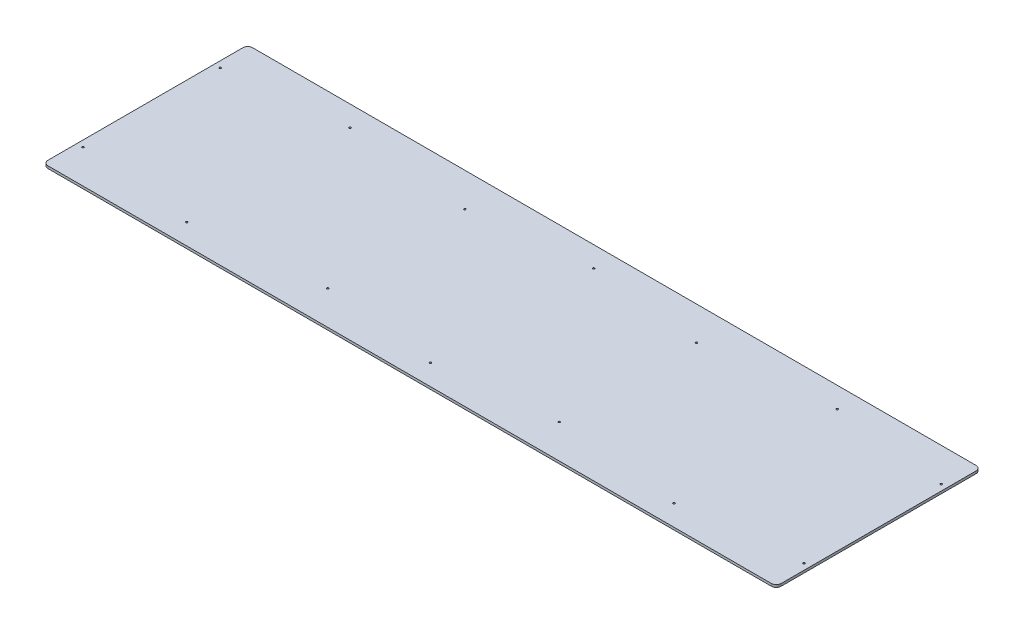
ISO-10303-21;
HEADER;
FILE_DESCRIPTION(('STEP AP214'),'2;1');
FILE_NAME('part.step','',(''),(''),'','','');
FILE_SCHEMA(('AUTOMOTIVE_DESIGN { 1 0 10303 214 1 1 1 1 }'));
ENDSEC;
DATA;
#1=APPLICATION_CONTEXT('core data for automotive mechanical design processes');
#2=APPLICATION_PROTOCOL_DEFINITION('international standard','automotive_design',2000,#1);
#3=PRODUCT_CONTEXT('',#1,'mechanical');
#4=PRODUCT('Part','Part','',(#3));
#5=PRODUCT_RELATED_PRODUCT_CATEGORY('part','',(#4));
#6=PRODUCT_DEFINITION_FORMATION('','',#4);
#7=PRODUCT_DEFINITION_CONTEXT('part definition',#1,'design');
#8=PRODUCT_DEFINITION('design','',#6,#7);
#9=PRODUCT_DEFINITION_SHAPE('','',#8);
#10=(LENGTH_UNIT() NAMED_UNIT(*) SI_UNIT(.MILLI.,.METRE.));
#11=(NAMED_UNIT(*) PLANE_ANGLE_UNIT() SI_UNIT($,.RADIAN.));
#12=(NAMED_UNIT(*) SI_UNIT($,.STERADIAN.) SOLID_ANGLE_UNIT());
#13=UNCERTAINTY_MEASURE_WITH_UNIT(LENGTH_MEASURE(1.E-05),#10,'distance_accuracy_value','');
#14=(GEOMETRIC_REPRESENTATION_CONTEXT(3) GLOBAL_UNCERTAINTY_ASSIGNED_CONTEXT((#13)) GLOBAL_UNIT_ASSIGNED_CONTEXT((#10,
#11,#12)) REPRESENTATION_CONTEXT('',''));
#15=CARTESIAN_POINT('',(0.,0.,0.));
#16=DIRECTION('',(0.,0.,1.));
#17=DIRECTION('',(1.,0.,0.));
#18=AXIS2_PLACEMENT_3D('',#15,#16,#17);
#19=CARTESIAN_POINT('',(0.,6.35,0.));
#20=DIRECTION('',(1.,0.,0.));
#21=DIRECTION('',(0.,0.,-1.));
#22=AXIS2_PLACEMENT_3D('',#19,#20,#21);
#23=PLANE('',#22);
#24=DIRECTION('',(0.,0.,1.));
#25=VECTOR('',#24,1.);
#26=CARTESIAN_POINT('',(0.,6.35,0.));
#27=LINE('',#26,#25);
#28=CARTESIAN_POINT('',(0.,6.35,-520.7));
#29=VERTEX_POINT('',#28);
#30=CARTESIAN_POINT('',(0.,6.35,-12.7));
#31=VERTEX_POINT('',#30);
#32=EDGE_CURVE('E125',#29,#31,#27,.T.);
#33=ORIENTED_EDGE('',*,*,#32,.F.);
#34=DIRECTION('',(0.,-1.,0.));
#35=VECTOR('',#34,1.);
#36=CARTESIAN_POINT('',(0.,6.35,-520.7));
#37=LINE('',#36,#35);
#38=CARTESIAN_POINT('',(0.,0.,-520.7));
#39=VERTEX_POINT('',#38);
#40=EDGE_CURVE('E151',#29,#39,#37,.T.);
#41=ORIENTED_EDGE('',*,*,#40,.T.);
#42=DIRECTION('',(0.,0.,1.));
#43=VECTOR('',#42,1.);
#44=CARTESIAN_POINT('',(0.,0.,0.));
#45=LINE('',#44,#43);
#46=CARTESIAN_POINT('',(0.,0.,-12.7));
#47=VERTEX_POINT('',#46);
#48=EDGE_CURVE('E159',#39,#47,#45,.T.);
#49=ORIENTED_EDGE('',*,*,#48,.T.);
#50=DIRECTION('',(0.,-1.,0.));
#51=VECTOR('',#50,1.);
#52=CARTESIAN_POINT('',(0.,6.35,-12.7));
#53=LINE('',#52,#51);
#54=EDGE_CURVE('E149',#47,#31,#53,.F.);
#55=ORIENTED_EDGE('',*,*,#54,.T.);
#56=EDGE_LOOP('',(#33,#41,#49,#55));
#57=FACE_BOUND('',#56,.T.);
#58=ADVANCED_FACE('F34',(#57),#23,.F.);
#59=CARTESIAN_POINT('',(0.,6.35,0.));
#60=DIRECTION('',(0.,0.,-1.));
#61=DIRECTION('',(-1.,0.,0.));
#62=AXIS2_PLACEMENT_3D('',#59,#60,#61);
#63=PLANE('',#62);
#64=DIRECTION('',(1.,0.,0.));
#65=VECTOR('',#64,1.);
#66=CARTESIAN_POINT('',(0.,0.,0.));
#67=LINE('',#66,#65);
#68=CARTESIAN_POINT('',(12.7,0.,0.));
#69=VERTEX_POINT('',#68);
#70=CARTESIAN_POINT('',(1898.65,0.,0.));
#71=VERTEX_POINT('',#70);
#72=EDGE_CURVE('E130',#69,#71,#67,.T.);
#73=ORIENTED_EDGE('',*,*,#72,.T.);
#74=DIRECTION('',(0.,-1.,0.));
#75=VECTOR('',#74,1.);
#76=CARTESIAN_POINT('',(1898.65,6.35,0.));
#77=LINE('',#76,#75);
#78=CARTESIAN_POINT('',(1898.65,6.35,0.));
#79=VERTEX_POINT('',#78);
#80=EDGE_CURVE('E11',#71,#79,#77,.F.);
#81=ORIENTED_EDGE('',*,*,#80,.T.);
#82=DIRECTION('',(1.,0.,0.));
#83=VECTOR('',#82,1.);
#84=CARTESIAN_POINT('',(0.,6.35,0.));
#85=LINE('',#84,#83);
#86=CARTESIAN_POINT('',(12.7,6.35,0.));
#87=VERTEX_POINT('',#86);
#88=EDGE_CURVE('E128',#87,#79,#85,.T.);
#89=ORIENTED_EDGE('',*,*,#88,.F.);
#90=DIRECTION('',(0.,-1.,0.));
#91=VECTOR('',#90,1.);
#92=CARTESIAN_POINT('',(12.7,6.35,0.));
#93=LINE('',#92,#91);
#94=EDGE_CURVE('E42',#87,#69,#93,.T.);
#95=ORIENTED_EDGE('',*,*,#94,.T.);
#96=EDGE_LOOP('',(#73,#81,#89,#95));
#97=FACE_BOUND('',#96,.T.);
#98=ADVANCED_FACE('F156',(#97),#63,.F.);
#99=CARTESIAN_POINT('',(1911.35,6.35,0.));
#100=DIRECTION('',(-1.,0.,0.));
#101=DIRECTION('',(0.,0.,1.));
#102=AXIS2_PLACEMENT_3D('',#99,#100,#101);
#103=PLANE('',#102);
#104=DIRECTION('',(0.,0.,-1.));
#105=VECTOR('',#104,1.);
#106=CARTESIAN_POINT('',(1911.35,0.,0.));
#107=LINE('',#106,#105);
#108=CARTESIAN_POINT('',(1911.35,0.,-12.7));
#109=VERTEX_POINT('',#108);
#110=CARTESIAN_POINT('',(1911.35,0.,-520.7));
#111=VERTEX_POINT('',#110);
#112=EDGE_CURVE('E126',#109,#111,#107,.T.);
#113=ORIENTED_EDGE('',*,*,#112,.T.);
#114=DIRECTION('',(0.,-1.,0.));
#115=VECTOR('',#114,1.);
#116=CARTESIAN_POINT('',(1911.35,6.35,-520.7));
#117=LINE('',#116,#115);
#118=CARTESIAN_POINT('',(1911.35,6.35,-520.7));
#119=VERTEX_POINT('',#118);
#120=EDGE_CURVE('E104',#111,#119,#117,.F.);
#121=ORIENTED_EDGE('',*,*,#120,.T.);
#122=DIRECTION('',(0.,0.,-1.));
#123=VECTOR('',#122,1.);
#124=CARTESIAN_POINT('',(1911.35,6.35,0.));
#125=LINE('',#124,#123);
#126=CARTESIAN_POINT('',(1911.35,6.35,-12.7));
#127=VERTEX_POINT('',#126);
#128=EDGE_CURVE('E164',#127,#119,#125,.T.);
#129=ORIENTED_EDGE('',*,*,#128,.F.);
#130=DIRECTION('',(0.,-1.,0.));
#131=VECTOR('',#130,1.);
#132=CARTESIAN_POINT('',(1911.35,6.35,-12.7));
#133=LINE('',#132,#131);
#134=EDGE_CURVE('E109',#127,#109,#133,.T.);
#135=ORIENTED_EDGE('',*,*,#134,.T.);
#136=EDGE_LOOP('',(#113,#121,#129,#135));
#137=FACE_BOUND('',#136,.T.);
#138=ADVANCED_FACE('F288',(#137),#103,.F.);
#139=CARTESIAN_POINT('',(0.,6.35,-533.4));
#140=DIRECTION('',(0.,0.,1.));
#141=DIRECTION('',(1.,0.,0.));
#142=AXIS2_PLACEMENT_3D('',#139,#140,#141);
#143=PLANE('',#142);
#144=DIRECTION('',(-1.,0.,0.));
#145=VECTOR('',#144,1.);
#146=CARTESIAN_POINT('',(0.,6.35,-533.4));
#147=LINE('',#146,#145);
#148=CARTESIAN_POINT('',(1898.65,6.35,-533.4));
#149=VERTEX_POINT('',#148);
#150=CARTESIAN_POINT('',(12.7,6.35,-533.4));
#151=VERTEX_POINT('',#150);
#152=EDGE_CURVE('E119',#149,#151,#147,.T.);
#153=ORIENTED_EDGE('',*,*,#152,.F.);
#154=DIRECTION('',(0.,-1.,0.));
#155=VECTOR('',#154,1.);
#156=CARTESIAN_POINT('',(1898.65,6.35,-533.4));
#157=LINE('',#156,#155);
#158=CARTESIAN_POINT('',(1898.65,0.,-533.4));
#159=VERTEX_POINT('',#158);
#160=EDGE_CURVE('E103',#149,#159,#157,.T.);
#161=ORIENTED_EDGE('',*,*,#160,.T.);
#162=DIRECTION('',(-1.,0.,0.));
#163=VECTOR('',#162,1.);
#164=CARTESIAN_POINT('',(0.,0.,-533.4));
#165=LINE('',#164,#163);
#166=CARTESIAN_POINT('',(12.7,0.,-533.4));
#167=VERTEX_POINT('',#166);
#168=EDGE_CURVE('E116',#159,#167,#165,.T.);
#169=ORIENTED_EDGE('',*,*,#168,.T.);
#170=DIRECTION('',(0.,-1.,0.));
#171=VECTOR('',#170,1.);
#172=CARTESIAN_POINT('',(12.7,6.35,-533.4));
#173=LINE('',#172,#171);
#174=EDGE_CURVE('E121',#167,#151,#173,.F.);
#175=ORIENTED_EDGE('',*,*,#174,.T.);
#176=EDGE_LOOP('',(#153,#161,#169,#175));
#177=FACE_BOUND('',#176,.T.);
#178=ADVANCED_FACE('F115',(#177),#143,.F.);
#179=CARTESIAN_POINT('',(0.,6.35,0.));
#180=DIRECTION('',(0.,-1.,0.));
#181=DIRECTION('',(0.,0.,-1.));
#182=AXIS2_PLACEMENT_3D('',#179,#180,#181);
#183=PLANE('',#182);
#184=CARTESIAN_POINT('',(320.675,6.35,-53.975));
#185=DIRECTION('',(0.,1.,0.));
#186=DIRECTION('',(0.,0.,1.));
#187=AXIS2_PLACEMENT_3D('',#184,#185,#186);
#188=CIRCLE('',#187,2.45109999999997);
#189=CARTESIAN_POINT('',(320.675,6.35,-51.5239));
#190=VERTEX_POINT('',#189);
#191=EDGE_CURVE('E241',#190,#190,#188,.T.);
#192=ORIENTED_EDGE('',*,*,#191,.F.);
#193=EDGE_LOOP('',(#192));
#194=FACE_BOUND('',#193,.T.);
#195=CARTESIAN_POINT('',(955.675,6.35,-53.975));
#196=DIRECTION('',(0.,1.,0.));
#197=DIRECTION('',(0.,0.,1.));
#198=AXIS2_PLACEMENT_3D('',#195,#196,#197);
#199=CIRCLE('',#198,2.45110000000003);
#200=CARTESIAN_POINT('',(955.675,6.35,-51.5239));
#201=VERTEX_POINT('',#200);
#202=EDGE_CURVE('E235',#201,#201,#199,.T.);
#203=ORIENTED_EDGE('',*,*,#202,.F.);
#204=EDGE_LOOP('',(#203));
#205=FACE_BOUND('',#204,.T.);
#206=CARTESIAN_POINT('',(955.675,6.35,-479.425));
#207=DIRECTION('',(0.,1.,0.));
#208=DIRECTION('',(0.,0.,1.));
#209=AXIS2_PLACEMENT_3D('',#206,#207,#208);
#210=CIRCLE('',#209,2.45110000000004);
#211=CARTESIAN_POINT('',(955.675,6.35,-476.9739));
#212=VERTEX_POINT('',#211);
#213=EDGE_CURVE('E229',#212,#212,#210,.T.);
#214=ORIENTED_EDGE('',*,*,#213,.F.);
#215=EDGE_LOOP('',(#214));
#216=FACE_BOUND('',#215,.T.);
#217=CARTESIAN_POINT('',(1590.675,6.35,-479.425));
#218=DIRECTION('',(0.,1.,0.));
#219=DIRECTION('',(0.,0.,1.));
#220=AXIS2_PLACEMENT_3D('',#217,#218,#219);
#221=CIRCLE('',#220,2.45110000000004);
#222=CARTESIAN_POINT('',(1590.675,6.35,-476.9739));
#223=VERTEX_POINT('',#222);
#224=EDGE_CURVE('E222',#223,#223,#221,.T.);
#225=ORIENTED_EDGE('',*,*,#224,.F.);
#226=EDGE_LOOP('',(#225));
#227=FACE_BOUND('',#226,.T.);
#228=CARTESIAN_POINT('',(1590.675,6.35,-53.975));
#229=DIRECTION('',(0.,1.,0.));
#230=DIRECTION('',(0.,0.,1.));
#231=AXIS2_PLACEMENT_3D('',#228,#229,#230);
#232=CIRCLE('',#231,2.45110000000003);
#233=CARTESIAN_POINT('',(1590.675,6.35,-51.5239));
#234=VERTEX_POINT('',#233);
#235=EDGE_CURVE('E246',#234,#234,#232,.T.);
#236=ORIENTED_EDGE('',*,*,#235,.F.);
#237=EDGE_LOOP('',(#236));
#238=FACE_BOUND('',#237,.T.);
#239=CARTESIAN_POINT('',(320.675,6.35,-479.425));
#240=DIRECTION('',(0.,1.,0.));
#241=DIRECTION('',(0.,0.,1.));
#242=AXIS2_PLACEMENT_3D('',#239,#240,#241);
#243=CIRCLE('',#242,2.45109999999997);
#244=CARTESIAN_POINT('',(320.675,6.35,-476.9739));
#245=VERTEX_POINT('',#244);
#246=EDGE_CURVE('E216',#245,#245,#243,.T.);
#247=ORIENTED_EDGE('',*,*,#246,.F.);
#248=EDGE_LOOP('',(#247));
#249=FACE_BOUND('',#248,.T.);
#250=CARTESIAN_POINT('',(1257.384666582,6.35,-445.643));
#251=DIRECTION('',(0.,1.,0.));
#252=DIRECTION('',(0.,0.,1.));
#253=AXIS2_PLACEMENT_3D('',#250,#251,#252);
#254=CIRCLE('',#253,2.45110000000004);
#255=CARTESIAN_POINT('',(1257.384666582,6.35,-443.1919));
#256=VERTEX_POINT('',#255);
#257=EDGE_CURVE('E186',#256,#256,#254,.T.);
#258=ORIENTED_EDGE('',*,*,#257,.F.);
#259=EDGE_LOOP('',(#258));
#260=FACE_BOUND('',#259,.T.);
#261=CARTESIAN_POINT('',(15.8750000000038,6.35,-88.011));
#262=DIRECTION('',(0.,1.,0.));
#263=DIRECTION('',(0.,0.,1.));
#264=AXIS2_PLACEMENT_3D('',#261,#262,#263);
#265=CIRCLE('',#264,2.4511);
#266=CARTESIAN_POINT('',(15.8750000000038,6.35,-85.5599));
#267=VERTEX_POINT('',#266);
#268=EDGE_CURVE('E193',#267,#267,#265,.T.);
#269=ORIENTED_EDGE('',*,*,#268,.F.);
#270=EDGE_LOOP('',(#269));
#271=FACE_BOUND('',#270,.T.);
#272=CARTESIAN_POINT('',(653.965333418004,6.35,-88.011));
#273=DIRECTION('',(0.,1.,0.));
#274=DIRECTION('',(0.,0.,1.));
#275=AXIS2_PLACEMENT_3D('',#272,#273,#274);
#276=CIRCLE('',#275,2.45110000000003);
#277=CARTESIAN_POINT('',(653.965333418004,6.35,-85.5599));
#278=VERTEX_POINT('',#277);
#279=EDGE_CURVE('E174',#278,#278,#276,.T.);
#280=ORIENTED_EDGE('',*,*,#279,.F.);
#281=EDGE_LOOP('',(#280));
#282=FACE_BOUND('',#281,.T.);
#283=CARTESIAN_POINT('',(653.965333418,6.35,-445.643));
#284=DIRECTION('',(0.,1.,0.));
#285=DIRECTION('',(0.,0.,1.));
#286=AXIS2_PLACEMENT_3D('',#283,#284,#285);
#287=CIRCLE('',#286,2.45110000000004);
#288=CARTESIAN_POINT('',(653.965333418,6.35,-443.1919));
#289=VERTEX_POINT('',#288);
#290=EDGE_CURVE('E181',#289,#289,#287,.T.);
#291=ORIENTED_EDGE('',*,*,#290,.F.);
#292=EDGE_LOOP('',(#291));
#293=FACE_BOUND('',#292,.T.);
#294=CARTESIAN_POINT('',(1895.475,6.35,-88.011));
#295=DIRECTION('',(0.,1.,0.));
#296=DIRECTION('',(0.,0.,1.));
#297=AXIS2_PLACEMENT_3D('',#294,#295,#296);
#298=CIRCLE('',#297,2.45110000000003);
#299=CARTESIAN_POINT('',(1895.475,6.35,-85.5599));
#300=VERTEX_POINT('',#299);
#301=EDGE_CURVE('E210',#300,#300,#298,.T.);
#302=ORIENTED_EDGE('',*,*,#301,.F.);
#303=EDGE_LOOP('',(#302));
#304=FACE_BOUND('',#303,.T.);
#305=CARTESIAN_POINT('',(1895.475,6.35,-445.643));
#306=DIRECTION('',(0.,1.,0.));
#307=DIRECTION('',(0.,0.,1.));
#308=AXIS2_PLACEMENT_3D('',#305,#306,#307);
#309=CIRCLE('',#308,2.45110000000004);
#310=CARTESIAN_POINT('',(1895.475,6.35,-443.1919));
#311=VERTEX_POINT('',#310);
#312=EDGE_CURVE('E198',#311,#311,#309,.T.);
#313=ORIENTED_EDGE('',*,*,#312,.F.);
#314=EDGE_LOOP('',(#313));
#315=FACE_BOUND('',#314,.T.);
#316=CARTESIAN_POINT('',(1257.384666582,6.35,-88.011));
#317=DIRECTION('',(0.,1.,0.));
#318=DIRECTION('',(0.,0.,1.));
#319=AXIS2_PLACEMENT_3D('',#316,#317,#318);
#320=CIRCLE('',#319,2.45110000000003);
#321=CARTESIAN_POINT('',(1257.384666582,6.35,-85.5599));
#322=VERTEX_POINT('',#321);
#323=EDGE_CURVE('E205',#322,#322,#320,.T.);
#324=ORIENTED_EDGE('',*,*,#323,.F.);
#325=EDGE_LOOP('',(#324));
#326=FACE_BOUND('',#325,.T.);
#327=CARTESIAN_POINT('',(15.8750000000001,6.35,-445.643));
#328=DIRECTION('',(0.,1.,0.));
#329=DIRECTION('',(0.,0.,1.));
#330=AXIS2_PLACEMENT_3D('',#327,#328,#329);
#331=CIRCLE('',#330,2.45109999999999);
#332=CARTESIAN_POINT('',(15.8750000000001,6.35,-443.1919));
#333=VERTEX_POINT('',#332);
#334=EDGE_CURVE('E168',#333,#333,#331,.T.);
#335=ORIENTED_EDGE('',*,*,#334,.F.);
#336=EDGE_LOOP('',(#335));
#337=FACE_BOUND('',#336,.T.);
#338=ORIENTED_EDGE('',*,*,#128,.T.);
#339=CARTESIAN_POINT('',(1898.65,6.35,-520.7));
#340=DIRECTION('',(0.,-1.,0.));
#341=DIRECTION('',(0.,0.,-1.));
#342=AXIS2_PLACEMENT_3D('',#339,#340,#341);
#343=CIRCLE('',#342,12.7);
#344=EDGE_CURVE('E147',#119,#149,#343,.F.);
#345=ORIENTED_EDGE('',*,*,#344,.T.);
#346=ORIENTED_EDGE('',*,*,#152,.T.);
#347=CARTESIAN_POINT('',(12.7,6.35,-520.7));
#348=DIRECTION('',(0.,-1.,0.));
#349=DIRECTION('',(0.,0.,-1.));
#350=AXIS2_PLACEMENT_3D('',#347,#348,#349);
#351=CIRCLE('',#350,12.7);
#352=EDGE_CURVE('E145',#151,#29,#351,.F.);
#353=ORIENTED_EDGE('',*,*,#352,.T.);
#354=ORIENTED_EDGE('',*,*,#32,.T.);
#355=CARTESIAN_POINT('',(12.7,6.35,-12.7));
#356=DIRECTION('',(0.,-1.,0.));
#357=DIRECTION('',(0.,0.,-1.));
#358=AXIS2_PLACEMENT_3D('',#355,#356,#357);
#359=CIRCLE('',#358,12.7);
#360=EDGE_CURVE('E54',#31,#87,#359,.F.);
#361=ORIENTED_EDGE('',*,*,#360,.T.);
#362=ORIENTED_EDGE('',*,*,#88,.T.);
#363=CARTESIAN_POINT('',(1898.65,6.35,-12.7));
#364=DIRECTION('',(0.,-1.,0.));
#365=DIRECTION('',(0.,0.,-1.));
#366=AXIS2_PLACEMENT_3D('',#363,#364,#365);
#367=CIRCLE('',#366,12.7);
#368=EDGE_CURVE('E143',#79,#127,#367,.F.);
#369=ORIENTED_EDGE('',*,*,#368,.T.);
#370=EDGE_LOOP('',(#338,#345,#346,#353,#354,#361,#362,#369));
#371=FACE_BOUND('',#370,.T.);
#372=ADVANCED_FACE('F262',(#194,#205,#216,#227,#238,#249,#260,#271,#282,#293,#304,#315,#326,
#337,#371),#183,.F.);
#373=CARTESIAN_POINT('',(0.,0.,0.));
#374=DIRECTION('',(0.,-1.,0.));
#375=DIRECTION('',(0.,0.,-1.));
#376=AXIS2_PLACEMENT_3D('',#373,#374,#375);
#377=PLANE('',#376);
#378=CARTESIAN_POINT('',(320.675,0.,-53.975));
#379=DIRECTION('',(0.,1.,0.));
#380=DIRECTION('',(0.,0.,1.));
#381=AXIS2_PLACEMENT_3D('',#378,#379,#380);
#382=CIRCLE('',#381,2.45109999999997);
#383=CARTESIAN_POINT('',(320.675,0.,-51.5239));
#384=VERTEX_POINT('',#383);
#385=EDGE_CURVE('E219',#384,#384,#382,.T.);
#386=ORIENTED_EDGE('',*,*,#385,.T.);
#387=EDGE_LOOP('',(#386));
#388=FACE_BOUND('',#387,.T.);
#389=CARTESIAN_POINT('',(955.675,0.,-53.975));
#390=DIRECTION('',(0.,1.,0.));
#391=DIRECTION('',(0.,0.,1.));
#392=AXIS2_PLACEMENT_3D('',#389,#390,#391);
#393=CIRCLE('',#392,2.45110000000003);
#394=CARTESIAN_POINT('',(955.675,0.,-51.5239));
#395=VERTEX_POINT('',#394);
#396=EDGE_CURVE('E238',#395,#395,#393,.T.);
#397=ORIENTED_EDGE('',*,*,#396,.T.);
#398=EDGE_LOOP('',(#397));
#399=FACE_BOUND('',#398,.T.);
#400=CARTESIAN_POINT('',(955.675,0.,-479.425));
#401=DIRECTION('',(0.,1.,0.));
#402=DIRECTION('',(0.,0.,1.));
#403=AXIS2_PLACEMENT_3D('',#400,#401,#402);
#404=CIRCLE('',#403,2.45110000000004);
#405=CARTESIAN_POINT('',(955.675,0.,-476.9739));
#406=VERTEX_POINT('',#405);
#407=EDGE_CURVE('E232',#406,#406,#404,.T.);
#408=ORIENTED_EDGE('',*,*,#407,.T.);
#409=EDGE_LOOP('',(#408));
#410=FACE_BOUND('',#409,.T.);
#411=CARTESIAN_POINT('',(1590.675,0.,-479.425));
#412=DIRECTION('',(0.,1.,0.));
#413=DIRECTION('',(0.,0.,1.));
#414=AXIS2_PLACEMENT_3D('',#411,#412,#413);
#415=CIRCLE('',#414,2.45110000000004);
#416=CARTESIAN_POINT('',(1590.675,0.,-476.9739));
#417=VERTEX_POINT('',#416);
#418=EDGE_CURVE('E225',#417,#417,#415,.T.);
#419=ORIENTED_EDGE('',*,*,#418,.T.);
#420=EDGE_LOOP('',(#419));
#421=FACE_BOUND('',#420,.T.);
#422=CARTESIAN_POINT('',(1590.675,0.,-53.975));
#423=DIRECTION('',(0.,1.,0.));
#424=DIRECTION('',(0.,0.,1.));
#425=AXIS2_PLACEMENT_3D('',#422,#423,#424);
#426=CIRCLE('',#425,2.45110000000003);
#427=CARTESIAN_POINT('',(1590.675,0.,-51.5239));
#428=VERTEX_POINT('',#427);
#429=EDGE_CURVE('E226',#428,#428,#426,.T.);
#430=ORIENTED_EDGE('',*,*,#429,.T.);
#431=EDGE_LOOP('',(#430));
#432=FACE_BOUND('',#431,.T.);
#433=CARTESIAN_POINT('',(320.675,0.,-479.425));
#434=DIRECTION('',(0.,1.,0.));
#435=DIRECTION('',(0.,0.,1.));
#436=AXIS2_PLACEMENT_3D('',#433,#434,#435);
#437=CIRCLE('',#436,2.45109999999997);
#438=CARTESIAN_POINT('',(320.675,0.,-476.9739));
#439=VERTEX_POINT('',#438);
#440=EDGE_CURVE('E213',#439,#439,#437,.T.);
#441=ORIENTED_EDGE('',*,*,#440,.T.);
#442=EDGE_LOOP('',(#441));
#443=FACE_BOUND('',#442,.T.);
#444=CARTESIAN_POINT('',(1257.384666582,0.,-445.643));
#445=DIRECTION('',(0.,1.,0.));
#446=DIRECTION('',(0.,0.,1.));
#447=AXIS2_PLACEMENT_3D('',#444,#445,#446);
#448=CIRCLE('',#447,2.45110000000004);
#449=CARTESIAN_POINT('',(1257.384666582,0.,-443.1919));
#450=VERTEX_POINT('',#449);
#451=EDGE_CURVE('E189',#450,#450,#448,.T.);
#452=ORIENTED_EDGE('',*,*,#451,.T.);
#453=EDGE_LOOP('',(#452));
#454=FACE_BOUND('',#453,.T.);
#455=CARTESIAN_POINT('',(15.8750000000038,0.,-88.011));
#456=DIRECTION('',(0.,1.,0.));
#457=DIRECTION('',(0.,0.,1.));
#458=AXIS2_PLACEMENT_3D('',#455,#456,#457);
#459=CIRCLE('',#458,2.4511);
#460=CARTESIAN_POINT('',(15.8750000000038,0.,-85.5599));
#461=VERTEX_POINT('',#460);
#462=EDGE_CURVE('E178',#461,#461,#459,.T.);
#463=ORIENTED_EDGE('',*,*,#462,.T.);
#464=EDGE_LOOP('',(#463));
#465=FACE_BOUND('',#464,.T.);
#466=CARTESIAN_POINT('',(653.965333418004,0.,-88.011));
#467=DIRECTION('',(0.,1.,0.));
#468=DIRECTION('',(0.,0.,1.));
#469=AXIS2_PLACEMENT_3D('',#466,#467,#468);
#470=CIRCLE('',#469,2.45110000000003);
#471=CARTESIAN_POINT('',(653.965333418004,0.,-85.5599));
#472=VERTEX_POINT('',#471);
#473=EDGE_CURVE('E177',#472,#472,#470,.T.);
#474=ORIENTED_EDGE('',*,*,#473,.T.);
#475=EDGE_LOOP('',(#474));
#476=FACE_BOUND('',#475,.T.);
#477=CARTESIAN_POINT('',(653.965333418,0.,-445.643));
#478=DIRECTION('',(0.,1.,0.));
#479=DIRECTION('',(0.,0.,1.));
#480=AXIS2_PLACEMENT_3D('',#477,#478,#479);
#481=CIRCLE('',#480,2.45110000000004);
#482=CARTESIAN_POINT('',(653.965333418,0.,-443.1919));
#483=VERTEX_POINT('',#482);
#484=EDGE_CURVE('E171',#483,#483,#481,.T.);
#485=ORIENTED_EDGE('',*,*,#484,.T.);
#486=EDGE_LOOP('',(#485));
#487=FACE_BOUND('',#486,.T.);
#488=CARTESIAN_POINT('',(1895.475,0.,-88.011));
#489=DIRECTION('',(0.,1.,0.));
#490=DIRECTION('',(0.,0.,1.));
#491=AXIS2_PLACEMENT_3D('',#488,#489,#490);
#492=CIRCLE('',#491,2.45110000000003);
#493=CARTESIAN_POINT('',(1895.475,0.,-85.5599));
#494=VERTEX_POINT('',#493);
#495=EDGE_CURVE('E202',#494,#494,#492,.T.);
#496=ORIENTED_EDGE('',*,*,#495,.T.);
#497=EDGE_LOOP('',(#496));
#498=FACE_BOUND('',#497,.T.);
#499=CARTESIAN_POINT('',(1895.475,0.,-445.643));
#500=DIRECTION('',(0.,1.,0.));
#501=DIRECTION('',(0.,0.,1.));
#502=AXIS2_PLACEMENT_3D('',#499,#500,#501);
#503=CIRCLE('',#502,2.45110000000004);
#504=CARTESIAN_POINT('',(1895.475,0.,-443.1919));
#505=VERTEX_POINT('',#504);
#506=EDGE_CURVE('E201',#505,#505,#503,.T.);
#507=ORIENTED_EDGE('',*,*,#506,.T.);
#508=EDGE_LOOP('',(#507));
#509=FACE_BOUND('',#508,.T.);
#510=CARTESIAN_POINT('',(1257.384666582,0.,-88.011));
#511=DIRECTION('',(0.,1.,0.));
#512=DIRECTION('',(0.,0.,1.));
#513=AXIS2_PLACEMENT_3D('',#510,#511,#512);
#514=CIRCLE('',#513,2.45110000000003);
#515=CARTESIAN_POINT('',(1257.384666582,0.,-85.5599));
#516=VERTEX_POINT('',#515);
#517=EDGE_CURVE('E190',#516,#516,#514,.T.);
#518=ORIENTED_EDGE('',*,*,#517,.T.);
#519=EDGE_LOOP('',(#518));
#520=FACE_BOUND('',#519,.T.);
#521=CARTESIAN_POINT('',(15.8750000000001,0.,-445.643));
#522=DIRECTION('',(0.,1.,0.));
#523=DIRECTION('',(0.,0.,1.));
#524=AXIS2_PLACEMENT_3D('',#521,#522,#523);
#525=CIRCLE('',#524,2.45109999999999);
#526=CARTESIAN_POINT('',(15.8750000000001,0.,-443.1919));
#527=VERTEX_POINT('',#526);
#528=EDGE_CURVE('E160',#527,#527,#525,.T.);
#529=ORIENTED_EDGE('',*,*,#528,.T.);
#530=EDGE_LOOP('',(#529));
#531=FACE_BOUND('',#530,.T.);
#532=ORIENTED_EDGE('',*,*,#168,.F.);
#533=CARTESIAN_POINT('',(1898.65,0.,-520.7));
#534=DIRECTION('',(0.,-1.,0.));
#535=DIRECTION('',(0.,0.,-1.));
#536=AXIS2_PLACEMENT_3D('',#533,#534,#535);
#537=CIRCLE('',#536,12.7);
#538=EDGE_CURVE('E99',#159,#111,#537,.T.);
#539=ORIENTED_EDGE('',*,*,#538,.T.);
#540=ORIENTED_EDGE('',*,*,#112,.F.);
#541=CARTESIAN_POINT('',(1898.65,0.,-12.7));
#542=DIRECTION('',(0.,-1.,0.));
#543=DIRECTION('',(0.,0.,-1.));
#544=AXIS2_PLACEMENT_3D('',#541,#542,#543);
#545=CIRCLE('',#544,12.7);
#546=EDGE_CURVE('E136',#109,#71,#545,.T.);
#547=ORIENTED_EDGE('',*,*,#546,.T.);
#548=ORIENTED_EDGE('',*,*,#72,.F.);
#549=CARTESIAN_POINT('',(12.7,0.,-12.7));
#550=DIRECTION('',(0.,-1.,0.));
#551=DIRECTION('',(0.,0.,-1.));
#552=AXIS2_PLACEMENT_3D('',#549,#550,#551);
#553=CIRCLE('',#552,12.7);
#554=EDGE_CURVE('E120',#69,#47,#553,.T.);
#555=ORIENTED_EDGE('',*,*,#554,.T.);
#556=ORIENTED_EDGE('',*,*,#48,.F.);
#557=CARTESIAN_POINT('',(12.7,0.,-520.7));
#558=DIRECTION('',(0.,-1.,0.));
#559=DIRECTION('',(0.,0.,-1.));
#560=AXIS2_PLACEMENT_3D('',#557,#558,#559);
#561=CIRCLE('',#560,12.7);
#562=EDGE_CURVE('E110',#39,#167,#561,.T.);
#563=ORIENTED_EDGE('',*,*,#562,.T.);
#564=EDGE_LOOP('',(#532,#539,#540,#547,#548,#555,#556,#563));
#565=FACE_BOUND('',#564,.T.);
#566=ADVANCED_FACE('F123',(#388,#399,#410,#421,#432,#443,#454,#465,#476,#487,#498,#509,#520,
#531,#565),#377,.T.);
#567=CARTESIAN_POINT('',(1898.65,6.35,-520.7));
#568=DIRECTION('',(0.,-1.,0.));
#569=DIRECTION('',(0.,0.,-1.));
#570=AXIS2_PLACEMENT_3D('',#567,#568,#569);
#571=CYLINDRICAL_SURFACE('',#570,12.7);
#572=ORIENTED_EDGE('',*,*,#344,.F.);
#573=ORIENTED_EDGE('',*,*,#120,.F.);
#574=ORIENTED_EDGE('',*,*,#538,.F.);
#575=ORIENTED_EDGE('',*,*,#160,.F.);
#576=EDGE_LOOP('',(#572,#573,#574,#575));
#577=FACE_BOUND('',#576,.T.);
#578=ADVANCED_FACE('F102',(#577),#571,.T.);
#579=CARTESIAN_POINT('',(12.7,6.35,-520.7));
#580=DIRECTION('',(0.,-1.,0.));
#581=DIRECTION('',(0.,0.,-1.));
#582=AXIS2_PLACEMENT_3D('',#579,#580,#581);
#583=CYLINDRICAL_SURFACE('',#582,12.7);
#584=ORIENTED_EDGE('',*,*,#352,.F.);
#585=ORIENTED_EDGE('',*,*,#174,.F.);
#586=ORIENTED_EDGE('',*,*,#562,.F.);
#587=ORIENTED_EDGE('',*,*,#40,.F.);
#588=EDGE_LOOP('',(#584,#585,#586,#587));
#589=FACE_BOUND('',#588,.T.);
#590=ADVANCED_FACE('F292',(#589),#583,.T.);
#591=CARTESIAN_POINT('',(1898.65,6.35,-12.7));
#592=DIRECTION('',(0.,-1.,0.));
#593=DIRECTION('',(0.,0.,-1.));
#594=AXIS2_PLACEMENT_3D('',#591,#592,#593);
#595=CYLINDRICAL_SURFACE('',#594,12.7);
#596=ORIENTED_EDGE('',*,*,#368,.F.);
#597=ORIENTED_EDGE('',*,*,#80,.F.);
#598=ORIENTED_EDGE('',*,*,#546,.F.);
#599=ORIENTED_EDGE('',*,*,#134,.F.);
#600=EDGE_LOOP('',(#596,#597,#598,#599));
#601=FACE_BOUND('',#600,.T.);
#602=ADVANCED_FACE('F290',(#601),#595,.T.);
#603=CARTESIAN_POINT('',(12.7,6.35,-12.7));
#604=DIRECTION('',(0.,-1.,0.));
#605=DIRECTION('',(0.,0.,-1.));
#606=AXIS2_PLACEMENT_3D('',#603,#604,#605);
#607=CYLINDRICAL_SURFACE('',#606,12.7);
#608=ORIENTED_EDGE('',*,*,#360,.F.);
#609=ORIENTED_EDGE('',*,*,#54,.F.);
#610=ORIENTED_EDGE('',*,*,#554,.F.);
#611=ORIENTED_EDGE('',*,*,#94,.F.);
#612=EDGE_LOOP('',(#608,#609,#610,#611));
#613=FACE_BOUND('',#612,.T.);
#614=ADVANCED_FACE('F36',(#613),#607,.T.);
#615=CARTESIAN_POINT('',(15.8750000000001,0.,-445.643));
#616=DIRECTION('',(0.,1.,0.));
#617=DIRECTION('',(0.,0.,1.));
#618=AXIS2_PLACEMENT_3D('',#615,#616,#617);
#619=CYLINDRICAL_SURFACE('',#618,2.45109999999999);
#620=ORIENTED_EDGE('',*,*,#528,.F.);
#621=EDGE_LOOP('',(#620));
#622=FACE_BOUND('',#621,.T.);
#623=ORIENTED_EDGE('',*,*,#334,.T.);
#624=EDGE_LOOP('',(#623));
#625=FACE_BOUND('',#624,.T.);
#626=ADVANCED_FACE('F297',(#622,#625),#619,.F.);
#627=CARTESIAN_POINT('',(1257.384666582,0.,-88.011));
#628=DIRECTION('',(0.,1.,0.));
#629=DIRECTION('',(0.,0.,1.));
#630=AXIS2_PLACEMENT_3D('',#627,#628,#629);
#631=CYLINDRICAL_SURFACE('',#630,2.45110000000003);
#632=ORIENTED_EDGE('',*,*,#517,.F.);
#633=EDGE_LOOP('',(#632));
#634=FACE_BOUND('',#633,.T.);
#635=ORIENTED_EDGE('',*,*,#323,.T.);
#636=EDGE_LOOP('',(#635));
#637=FACE_BOUND('',#636,.T.);
#638=ADVANCED_FACE('F413',(#634,#637),#631,.F.);
#639=CARTESIAN_POINT('',(1895.475,0.,-445.643));
#640=DIRECTION('',(0.,1.,0.));
#641=DIRECTION('',(0.,0.,1.));
#642=AXIS2_PLACEMENT_3D('',#639,#640,#641);
#643=CYLINDRICAL_SURFACE('',#642,2.45110000000004);
#644=ORIENTED_EDGE('',*,*,#506,.F.);
#645=EDGE_LOOP('',(#644));
#646=FACE_BOUND('',#645,.T.);
#647=ORIENTED_EDGE('',*,*,#312,.T.);
#648=EDGE_LOOP('',(#647));
#649=FACE_BOUND('',#648,.T.);
#650=ADVANCED_FACE('F411',(#646,#649),#643,.F.);
#651=CARTESIAN_POINT('',(1895.475,0.,-88.011));
#652=DIRECTION('',(0.,1.,0.));
#653=DIRECTION('',(0.,0.,1.));
#654=AXIS2_PLACEMENT_3D('',#651,#652,#653);
#655=CYLINDRICAL_SURFACE('',#654,2.45110000000003);
#656=ORIENTED_EDGE('',*,*,#495,.F.);
#657=EDGE_LOOP('',(#656));
#658=FACE_BOUND('',#657,.T.);
#659=ORIENTED_EDGE('',*,*,#301,.T.);
#660=EDGE_LOOP('',(#659));
#661=FACE_BOUND('',#660,.T.);
#662=ADVANCED_FACE('F407',(#658,#661),#655,.F.);
#663=CARTESIAN_POINT('',(653.965333418,0.,-445.643));
#664=DIRECTION('',(0.,1.,0.));
#665=DIRECTION('',(0.,0.,1.));
#666=AXIS2_PLACEMENT_3D('',#663,#664,#665);
#667=CYLINDRICAL_SURFACE('',#666,2.45110000000004);
#668=ORIENTED_EDGE('',*,*,#484,.F.);
#669=EDGE_LOOP('',(#668));
#670=FACE_BOUND('',#669,.T.);
#671=ORIENTED_EDGE('',*,*,#290,.T.);
#672=EDGE_LOOP('',(#671));
#673=FACE_BOUND('',#672,.T.);
#674=ADVANCED_FACE('F410',(#670,#673),#667,.F.);
#675=CARTESIAN_POINT('',(653.965333418004,0.,-88.011));
#676=DIRECTION('',(0.,1.,0.));
#677=DIRECTION('',(0.,0.,1.));
#678=AXIS2_PLACEMENT_3D('',#675,#676,#677);
#679=CYLINDRICAL_SURFACE('',#678,2.45110000000003);
#680=ORIENTED_EDGE('',*,*,#473,.F.);
#681=EDGE_LOOP('',(#680));
#682=FACE_BOUND('',#681,.T.);
#683=ORIENTED_EDGE('',*,*,#279,.T.);
#684=EDGE_LOOP('',(#683));
#685=FACE_BOUND('',#684,.T.);
#686=ADVANCED_FACE('F423',(#682,#685),#679,.F.);
#687=CARTESIAN_POINT('',(15.8750000000038,0.,-88.011));
#688=DIRECTION('',(0.,1.,0.));
#689=DIRECTION('',(0.,0.,1.));
#690=AXIS2_PLACEMENT_3D('',#687,#688,#689);
#691=CYLINDRICAL_SURFACE('',#690,2.4511);
#692=ORIENTED_EDGE('',*,*,#462,.F.);
#693=EDGE_LOOP('',(#692));
#694=FACE_BOUND('',#693,.T.);
#695=ORIENTED_EDGE('',*,*,#268,.T.);
#696=EDGE_LOOP('',(#695));
#697=FACE_BOUND('',#696,.T.);
#698=ADVANCED_FACE('F420',(#694,#697),#691,.F.);
#699=CARTESIAN_POINT('',(1257.384666582,0.,-445.643));
#700=DIRECTION('',(0.,1.,0.));
#701=DIRECTION('',(0.,0.,1.));
#702=AXIS2_PLACEMENT_3D('',#699,#700,#701);
#703=CYLINDRICAL_SURFACE('',#702,2.45110000000004);
#704=ORIENTED_EDGE('',*,*,#451,.F.);
#705=EDGE_LOOP('',(#704));
#706=FACE_BOUND('',#705,.T.);
#707=ORIENTED_EDGE('',*,*,#257,.T.);
#708=EDGE_LOOP('',(#707));
#709=FACE_BOUND('',#708,.T.);
#710=ADVANCED_FACE('F341',(#706,#709),#703,.F.);
#711=CARTESIAN_POINT('',(320.675,0.,-479.425));
#712=DIRECTION('',(0.,1.,0.));
#713=DIRECTION('',(0.,0.,1.));
#714=AXIS2_PLACEMENT_3D('',#711,#712,#713);
#715=CYLINDRICAL_SURFACE('',#714,2.45109999999997);
#716=ORIENTED_EDGE('',*,*,#440,.F.);
#717=EDGE_LOOP('',(#716));
#718=FACE_BOUND('',#717,.T.);
#719=ORIENTED_EDGE('',*,*,#246,.T.);
#720=EDGE_LOOP('',(#719));
#721=FACE_BOUND('',#720,.T.);
#722=ADVANCED_FACE('F258',(#718,#721),#715,.F.);
#723=CARTESIAN_POINT('',(1590.675,0.,-53.975));
#724=DIRECTION('',(0.,1.,0.));
#725=DIRECTION('',(0.,0.,1.));
#726=AXIS2_PLACEMENT_3D('',#723,#724,#725);
#727=CYLINDRICAL_SURFACE('',#726,2.45110000000003);
#728=ORIENTED_EDGE('',*,*,#429,.F.);
#729=EDGE_LOOP('',(#728));
#730=FACE_BOUND('',#729,.T.);
#731=ORIENTED_EDGE('',*,*,#235,.T.);
#732=EDGE_LOOP('',(#731));
#733=FACE_BOUND('',#732,.T.);
#734=ADVANCED_FACE('F254',(#730,#733),#727,.F.);
#735=CARTESIAN_POINT('',(1590.675,0.,-479.425));
#736=DIRECTION('',(0.,1.,0.));
#737=DIRECTION('',(0.,0.,1.));
#738=AXIS2_PLACEMENT_3D('',#735,#736,#737);
#739=CYLINDRICAL_SURFACE('',#738,2.45110000000004);
#740=ORIENTED_EDGE('',*,*,#418,.F.);
#741=EDGE_LOOP('',(#740));
#742=FACE_BOUND('',#741,.T.);
#743=ORIENTED_EDGE('',*,*,#224,.T.);
#744=EDGE_LOOP('',(#743));
#745=FACE_BOUND('',#744,.T.);
#746=ADVANCED_FACE('F257',(#742,#745),#739,.F.);
#747=CARTESIAN_POINT('',(955.675,0.,-479.425));
#748=DIRECTION('',(0.,1.,0.));
#749=DIRECTION('',(0.,0.,1.));
#750=AXIS2_PLACEMENT_3D('',#747,#748,#749);
#751=CYLINDRICAL_SURFACE('',#750,2.45110000000004);
#752=ORIENTED_EDGE('',*,*,#407,.F.);
#753=EDGE_LOOP('',(#752));
#754=FACE_BOUND('',#753,.T.);
#755=ORIENTED_EDGE('',*,*,#213,.T.);
#756=EDGE_LOOP('',(#755));
#757=FACE_BOUND('',#756,.T.);
#758=ADVANCED_FACE('F370',(#754,#757),#751,.F.);
#759=CARTESIAN_POINT('',(955.675,0.,-53.975));
#760=DIRECTION('',(0.,1.,0.));
#761=DIRECTION('',(0.,0.,1.));
#762=AXIS2_PLACEMENT_3D('',#759,#760,#761);
#763=CYLINDRICAL_SURFACE('',#762,2.45110000000003);
#764=ORIENTED_EDGE('',*,*,#396,.F.);
#765=EDGE_LOOP('',(#764));
#766=FACE_BOUND('',#765,.T.);
#767=ORIENTED_EDGE('',*,*,#202,.T.);
#768=EDGE_LOOP('',(#767));
#769=FACE_BOUND('',#768,.T.);
#770=ADVANCED_FACE('F380',(#766,#769),#763,.F.);
#771=CARTESIAN_POINT('',(320.675,0.,-53.975));
#772=DIRECTION('',(0.,1.,0.));
#773=DIRECTION('',(0.,0.,1.));
#774=AXIS2_PLACEMENT_3D('',#771,#772,#773);
#775=CYLINDRICAL_SURFACE('',#774,2.45109999999997);
#776=ORIENTED_EDGE('',*,*,#385,.F.);
#777=EDGE_LOOP('',(#776));
#778=FACE_BOUND('',#777,.T.);
#779=ORIENTED_EDGE('',*,*,#191,.T.);
#780=EDGE_LOOP('',(#779));
#781=FACE_BOUND('',#780,.T.);
#782=ADVANCED_FACE('F390',(#778,#781),#775,.F.);
#783=CLOSED_SHELL('',(#58,#98,#138,#178,#372,#566,#578,#590,#602,#614,#626,#638,#650,#662,#674,
#686,#698,#710,#722,#734,#746,#758,#770,#782));
#784=MANIFOLD_SOLID_BREP('B2',#783);
#785=ADVANCED_BREP_SHAPE_REPRESENTATION('',(#18,#784),#14);
#786=SHAPE_DEFINITION_REPRESENTATION(#9,#785);
ENDSEC;
END-ISO-10303-21;
